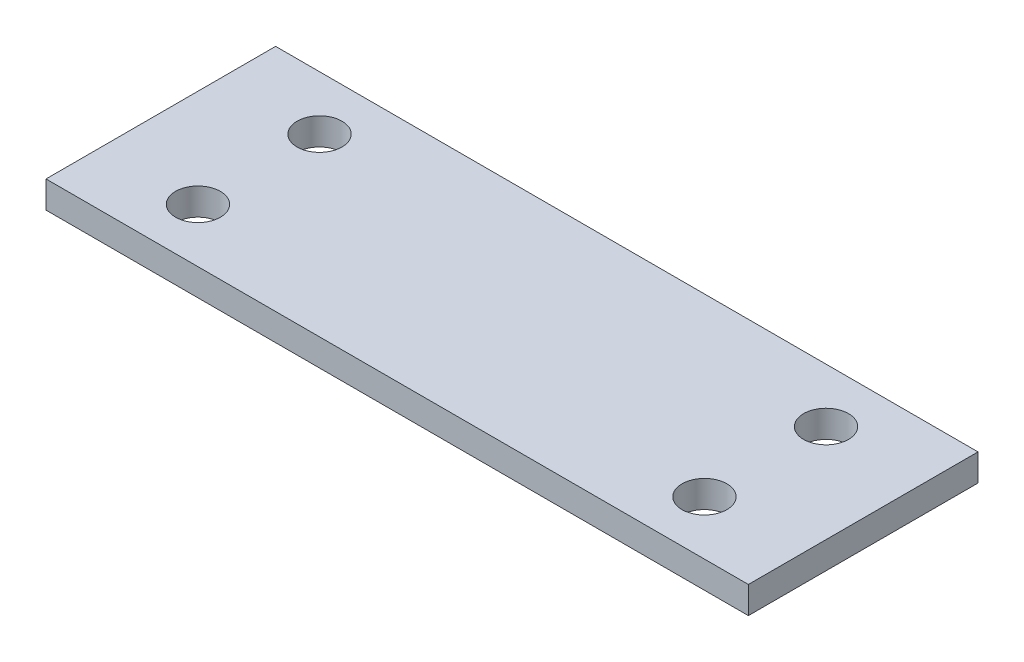
ISO-10303-21;
HEADER;
FILE_DESCRIPTION(('STEP AP214'),'2;1');
FILE_NAME('part.step','',(''),(''),'','','');
FILE_SCHEMA(('AUTOMOTIVE_DESIGN { 1 0 10303 214 1 1 1 1 }'));
ENDSEC;
DATA;
#1=APPLICATION_CONTEXT('core data for automotive mechanical design processes');
#2=APPLICATION_PROTOCOL_DEFINITION('international standard','automotive_design',2000,#1);
#3=PRODUCT_CONTEXT('',#1,'mechanical');
#4=PRODUCT('Part','Part','',(#3));
#5=PRODUCT_RELATED_PRODUCT_CATEGORY('part','',(#4));
#6=PRODUCT_DEFINITION_FORMATION('','',#4);
#7=PRODUCT_DEFINITION_CONTEXT('part definition',#1,'design');
#8=PRODUCT_DEFINITION('design','',#6,#7);
#9=PRODUCT_DEFINITION_SHAPE('','',#8);
#10=(LENGTH_UNIT() NAMED_UNIT(*) SI_UNIT(.MILLI.,.METRE.));
#11=(NAMED_UNIT(*) PLANE_ANGLE_UNIT() SI_UNIT($,.RADIAN.));
#12=(NAMED_UNIT(*) SI_UNIT($,.STERADIAN.) SOLID_ANGLE_UNIT());
#13=UNCERTAINTY_MEASURE_WITH_UNIT(LENGTH_MEASURE(1.E-05),#10,'distance_accuracy_value','');
#14=(GEOMETRIC_REPRESENTATION_CONTEXT(3) GLOBAL_UNCERTAINTY_ASSIGNED_CONTEXT((#13)) GLOBAL_UNIT_ASSIGNED_CONTEXT((#10,
#11,#12)) REPRESENTATION_CONTEXT('',''));
#15=CARTESIAN_POINT('',(0.,0.,0.));
#16=DIRECTION('',(0.,0.,1.));
#17=DIRECTION('',(1.,0.,0.));
#18=AXIS2_PLACEMENT_3D('',#15,#16,#17);
#19=CARTESIAN_POINT('',(-61.6640305085016,5.08,-29.8531505250875));
#20=DIRECTION('',(1.,0.,0.));
#21=DIRECTION('',(0.,0.,-1.));
#22=AXIS2_PLACEMENT_3D('',#19,#20,#21);
#23=PLANE('',#22);
#24=DIRECTION('',(0.,0.,1.));
#25=VECTOR('',#24,1.);
#26=CARTESIAN_POINT('',(-61.6640305085016,0.,-29.8531505250875));
#27=LINE('',#26,#25);
#28=CARTESIAN_POINT('',(-61.6640305085016,0.,-29.8531505250875));
#29=VERTEX_POINT('',#28);
#30=CARTESIAN_POINT('',(-61.6640305085016,0.,13.3268494749125));
#31=VERTEX_POINT('',#30);
#32=EDGE_CURVE('E110',#29,#31,#27,.T.);
#33=ORIENTED_EDGE('',*,*,#32,.T.);
#34=DIRECTION('',(0.,-1.,0.));
#35=VECTOR('',#34,1.);
#36=CARTESIAN_POINT('',(-61.6640305085016,5.08,13.3268494749125));
#37=LINE('',#36,#35);
#38=CARTESIAN_POINT('',(-61.6640305085016,5.08,13.3268494749125));
#39=VERTEX_POINT('',#38);
#40=EDGE_CURVE('E11',#39,#31,#37,.T.);
#41=ORIENTED_EDGE('',*,*,#40,.F.);
#42=DIRECTION('',(0.,0.,1.));
#43=VECTOR('',#42,1.);
#44=CARTESIAN_POINT('',(-61.6640305085016,5.08,-29.8531505250875));
#45=LINE('',#44,#43);
#46=CARTESIAN_POINT('',(-61.6640305085016,5.08,-29.8531505250875));
#47=VERTEX_POINT('',#46);
#48=EDGE_CURVE('E94',#47,#39,#45,.T.);
#49=ORIENTED_EDGE('',*,*,#48,.F.);
#50=DIRECTION('',(0.,-1.,0.));
#51=VECTOR('',#50,1.);
#52=CARTESIAN_POINT('',(-61.6640305085016,5.08,-29.8531505250875));
#53=LINE('',#52,#51);
#54=EDGE_CURVE('E106',#47,#29,#53,.T.);
#55=ORIENTED_EDGE('',*,*,#54,.T.);
#56=EDGE_LOOP('',(#33,#41,#49,#55));
#57=FACE_BOUND('',#56,.T.);
#58=ADVANCED_FACE('F42',(#57),#23,.F.);
#59=CARTESIAN_POINT('',(-61.6640305085016,5.08,13.3268494749125));
#60=DIRECTION('',(0.,0.,-1.));
#61=DIRECTION('',(-1.,0.,0.));
#62=AXIS2_PLACEMENT_3D('',#59,#60,#61);
#63=PLANE('',#62);
#64=DIRECTION('',(1.,0.,0.));
#65=VECTOR('',#64,1.);
#66=CARTESIAN_POINT('',(-61.6640305085016,0.,13.3268494749125));
#67=LINE('',#66,#65);
#68=CARTESIAN_POINT('',(70.4159694914983,0.,13.3268494749125));
#69=VERTEX_POINT('',#68);
#70=EDGE_CURVE('E99',#31,#69,#67,.T.);
#71=ORIENTED_EDGE('',*,*,#70,.T.);
#72=DIRECTION('',(0.,-1.,0.));
#73=VECTOR('',#72,1.);
#74=CARTESIAN_POINT('',(70.4159694914983,5.08,13.3268494749125));
#75=LINE('',#74,#73);
#76=CARTESIAN_POINT('',(70.4159694914983,5.08,13.3268494749125));
#77=VERTEX_POINT('',#76);
#78=EDGE_CURVE('E51',#77,#69,#75,.T.);
#79=ORIENTED_EDGE('',*,*,#78,.F.);
#80=DIRECTION('',(1.,0.,0.));
#81=VECTOR('',#80,1.);
#82=CARTESIAN_POINT('',(-61.6640305085016,5.08,13.3268494749125));
#83=LINE('',#82,#81);
#84=EDGE_CURVE('E89',#39,#77,#83,.T.);
#85=ORIENTED_EDGE('',*,*,#84,.F.);
#86=ORIENTED_EDGE('',*,*,#40,.T.);
#87=EDGE_LOOP('',(#71,#79,#85,#86));
#88=FACE_BOUND('',#87,.T.);
#89=ADVANCED_FACE('F98',(#88),#63,.F.);
#90=CARTESIAN_POINT('',(70.4159694914984,5.08,-29.8531505250875));
#91=DIRECTION('',(-1.,0.,0.));
#92=DIRECTION('',(0.,0.,1.));
#93=AXIS2_PLACEMENT_3D('',#90,#91,#92);
#94=PLANE('',#93);
#95=DIRECTION('',(0.,0.,-1.));
#96=VECTOR('',#95,1.);
#97=CARTESIAN_POINT('',(70.4159694914984,0.,-29.8531505250875));
#98=LINE('',#97,#96);
#99=CARTESIAN_POINT('',(70.4159694914984,0.,-29.8531505250875));
#100=VERTEX_POINT('',#99);
#101=EDGE_CURVE('E76',#69,#100,#98,.T.);
#102=ORIENTED_EDGE('',*,*,#101,.T.);
#103=DIRECTION('',(0.,-1.,0.));
#104=VECTOR('',#103,1.);
#105=CARTESIAN_POINT('',(70.4159694914984,5.08,-29.8531505250875));
#106=LINE('',#105,#104);
#107=CARTESIAN_POINT('',(70.4159694914984,5.08,-29.8531505250875));
#108=VERTEX_POINT('',#107);
#109=EDGE_CURVE('E101',#108,#100,#106,.T.);
#110=ORIENTED_EDGE('',*,*,#109,.F.);
#111=DIRECTION('',(0.,0.,-1.));
#112=VECTOR('',#111,1.);
#113=CARTESIAN_POINT('',(70.4159694914984,5.08,-29.8531505250875));
#114=LINE('',#113,#112);
#115=EDGE_CURVE('E92',#77,#108,#114,.T.);
#116=ORIENTED_EDGE('',*,*,#115,.F.);
#117=ORIENTED_EDGE('',*,*,#78,.T.);
#118=EDGE_LOOP('',(#102,#110,#116,#117));
#119=FACE_BOUND('',#118,.T.);
#120=ADVANCED_FACE('F102',(#119),#94,.F.);
#121=CARTESIAN_POINT('',(-61.6640305085016,5.08,-29.8531505250875));
#122=DIRECTION('',(0.,0.,1.));
#123=DIRECTION('',(1.,0.,0.));
#124=AXIS2_PLACEMENT_3D('',#121,#122,#123);
#125=PLANE('',#124);
#126=DIRECTION('',(-1.,0.,0.));
#127=VECTOR('',#126,1.);
#128=CARTESIAN_POINT('',(-61.6640305085016,0.,-29.8531505250875));
#129=LINE('',#128,#127);
#130=EDGE_CURVE('E82',#100,#29,#129,.T.);
#131=ORIENTED_EDGE('',*,*,#130,.T.);
#132=ORIENTED_EDGE('',*,*,#54,.F.);
#133=DIRECTION('',(-1.,0.,0.));
#134=VECTOR('',#133,1.);
#135=CARTESIAN_POINT('',(-61.6640305085016,5.08,-29.8531505250875));
#136=LINE('',#135,#134);
#137=EDGE_CURVE('E59',#108,#47,#136,.T.);
#138=ORIENTED_EDGE('',*,*,#137,.F.);
#139=ORIENTED_EDGE('',*,*,#109,.T.);
#140=EDGE_LOOP('',(#131,#132,#138,#139));
#141=FACE_BOUND('',#140,.T.);
#142=ADVANCED_FACE('F124',(#141),#125,.F.);
#143=CARTESIAN_POINT('',(0.,5.08,0.));
#144=DIRECTION('',(0.,1.,0.));
#145=DIRECTION('',(0.,0.,1.));
#146=AXIS2_PLACEMENT_3D('',#143,#144,#145);
#147=PLANE('',#146);
#148=CARTESIAN_POINT('',(-43.2490305085016,5.08,-19.6931505250875));
#149=DIRECTION('',(0.,1.,0.));
#150=DIRECTION('',(0.,0.,1.));
#151=AXIS2_PLACEMENT_3D('',#148,#149,#150);
#152=CIRCLE('',#151,4.2164);
#153=CARTESIAN_POINT('',(-43.2490305085016,5.08,-15.4767505250875));
#154=VERTEX_POINT('',#153);
#155=EDGE_CURVE('E158',#154,#154,#152,.T.);
#156=ORIENTED_EDGE('',*,*,#155,.F.);
#157=EDGE_LOOP('',(#156));
#158=FACE_BOUND('',#157,.T.);
#159=CARTESIAN_POINT('',(-43.2490305085016,5.08,3.16684947491247));
#160=DIRECTION('',(0.,1.,0.));
#161=DIRECTION('',(0.,0.,1.));
#162=AXIS2_PLACEMENT_3D('',#159,#160,#161);
#163=CIRCLE('',#162,4.2164);
#164=CARTESIAN_POINT('',(-43.2490305085016,5.08,7.38324947491247));
#165=VERTEX_POINT('',#164);
#166=EDGE_CURVE('E150',#165,#165,#163,.T.);
#167=ORIENTED_EDGE('',*,*,#166,.F.);
#168=EDGE_LOOP('',(#167));
#169=FACE_BOUND('',#168,.T.);
#170=CARTESIAN_POINT('',(52.0009694914984,5.08,-19.6931505250875));
#171=DIRECTION('',(0.,1.,0.));
#172=DIRECTION('',(0.,0.,1.));
#173=AXIS2_PLACEMENT_3D('',#170,#171,#172);
#174=CIRCLE('',#173,4.2164);
#175=CARTESIAN_POINT('',(52.0009694914984,5.08,-15.4767505250875));
#176=VERTEX_POINT('',#175);
#177=EDGE_CURVE('E142',#176,#176,#174,.T.);
#178=ORIENTED_EDGE('',*,*,#177,.F.);
#179=EDGE_LOOP('',(#178));
#180=FACE_BOUND('',#179,.T.);
#181=CARTESIAN_POINT('',(52.0009694914984,5.08,3.16684947491247));
#182=DIRECTION('',(0.,1.,0.));
#183=DIRECTION('',(0.,0.,1.));
#184=AXIS2_PLACEMENT_3D('',#181,#182,#183);
#185=CIRCLE('',#184,4.2164);
#186=CARTESIAN_POINT('',(52.0009694914984,5.08,7.38324947491247));
#187=VERTEX_POINT('',#186);
#188=EDGE_CURVE('E134',#187,#187,#185,.T.);
#189=ORIENTED_EDGE('',*,*,#188,.F.);
#190=EDGE_LOOP('',(#189));
#191=FACE_BOUND('',#190,.T.);
#192=ORIENTED_EDGE('',*,*,#48,.T.);
#193=ORIENTED_EDGE('',*,*,#84,.T.);
#194=ORIENTED_EDGE('',*,*,#115,.T.);
#195=ORIENTED_EDGE('',*,*,#137,.T.);
#196=EDGE_LOOP('',(#192,#193,#194,#195));
#197=FACE_BOUND('',#196,.T.);
#198=ADVANCED_FACE('F90',(#158,#169,#180,#191,#197),#147,.T.);
#199=CARTESIAN_POINT('',(0.,0.,0.));
#200=DIRECTION('',(0.,1.,0.));
#201=DIRECTION('',(0.,0.,1.));
#202=AXIS2_PLACEMENT_3D('',#199,#200,#201);
#203=PLANE('',#202);
#204=CARTESIAN_POINT('',(-43.2490305085016,0.,-19.6931505250875));
#205=DIRECTION('',(0.,1.,0.));
#206=DIRECTION('',(0.,0.,1.));
#207=AXIS2_PLACEMENT_3D('',#204,#205,#206);
#208=CIRCLE('',#207,4.2164);
#209=CARTESIAN_POINT('',(-43.2490305085016,0.,-15.4767505250875));
#210=VERTEX_POINT('',#209);
#211=EDGE_CURVE('E154',#210,#210,#208,.T.);
#212=ORIENTED_EDGE('',*,*,#211,.T.);
#213=EDGE_LOOP('',(#212));
#214=FACE_BOUND('',#213,.T.);
#215=CARTESIAN_POINT('',(-43.2490305085016,0.,3.16684947491247));
#216=DIRECTION('',(0.,1.,0.));
#217=DIRECTION('',(0.,0.,1.));
#218=AXIS2_PLACEMENT_3D('',#215,#216,#217);
#219=CIRCLE('',#218,4.2164);
#220=CARTESIAN_POINT('',(-43.2490305085016,0.,7.38324947491247));
#221=VERTEX_POINT('',#220);
#222=EDGE_CURVE('E146',#221,#221,#219,.T.);
#223=ORIENTED_EDGE('',*,*,#222,.T.);
#224=EDGE_LOOP('',(#223));
#225=FACE_BOUND('',#224,.T.);
#226=CARTESIAN_POINT('',(52.0009694914984,0.,-19.6931505250875));
#227=DIRECTION('',(0.,1.,0.));
#228=DIRECTION('',(0.,0.,1.));
#229=AXIS2_PLACEMENT_3D('',#226,#227,#228);
#230=CIRCLE('',#229,4.2164);
#231=CARTESIAN_POINT('',(52.0009694914984,0.,-15.4767505250875));
#232=VERTEX_POINT('',#231);
#233=EDGE_CURVE('E138',#232,#232,#230,.T.);
#234=ORIENTED_EDGE('',*,*,#233,.T.);
#235=EDGE_LOOP('',(#234));
#236=FACE_BOUND('',#235,.T.);
#237=CARTESIAN_POINT('',(52.0009694914984,0.,3.16684947491247));
#238=DIRECTION('',(0.,1.,0.));
#239=DIRECTION('',(0.,0.,1.));
#240=AXIS2_PLACEMENT_3D('',#237,#238,#239);
#241=CIRCLE('',#240,4.2164);
#242=CARTESIAN_POINT('',(52.0009694914984,0.,7.38324947491247));
#243=VERTEX_POINT('',#242);
#244=EDGE_CURVE('E114',#243,#243,#241,.T.);
#245=ORIENTED_EDGE('',*,*,#244,.T.);
#246=EDGE_LOOP('',(#245));
#247=FACE_BOUND('',#246,.T.);
#248=ORIENTED_EDGE('',*,*,#32,.F.);
#249=ORIENTED_EDGE('',*,*,#130,.F.);
#250=ORIENTED_EDGE('',*,*,#101,.F.);
#251=ORIENTED_EDGE('',*,*,#70,.F.);
#252=EDGE_LOOP('',(#248,#249,#250,#251));
#253=FACE_BOUND('',#252,.T.);
#254=ADVANCED_FACE('F127',(#214,#225,#236,#247,#253),#203,.F.);
#255=CARTESIAN_POINT('',(52.0009694914984,5.08,3.16684947491247));
#256=DIRECTION('',(0.,1.,0.));
#257=DIRECTION('',(0.,0.,1.));
#258=AXIS2_PLACEMENT_3D('',#255,#256,#257);
#259=CYLINDRICAL_SURFACE('',#258,4.2164);
#260=ORIENTED_EDGE('',*,*,#244,.F.);
#261=EDGE_LOOP('',(#260));
#262=FACE_BOUND('',#261,.T.);
#263=ORIENTED_EDGE('',*,*,#188,.T.);
#264=EDGE_LOOP('',(#263));
#265=FACE_BOUND('',#264,.T.);
#266=ADVANCED_FACE('F174',(#262,#265),#259,.F.);
#267=CARTESIAN_POINT('',(52.0009694914984,5.08,-19.6931505250875));
#268=DIRECTION('',(0.,1.,0.));
#269=DIRECTION('',(0.,0.,1.));
#270=AXIS2_PLACEMENT_3D('',#267,#268,#269);
#271=CYLINDRICAL_SURFACE('',#270,4.2164);
#272=ORIENTED_EDGE('',*,*,#233,.F.);
#273=EDGE_LOOP('',(#272));
#274=FACE_BOUND('',#273,.T.);
#275=ORIENTED_EDGE('',*,*,#177,.T.);
#276=EDGE_LOOP('',(#275));
#277=FACE_BOUND('',#276,.T.);
#278=ADVANCED_FACE('F176',(#274,#277),#271,.F.);
#279=CARTESIAN_POINT('',(-43.2490305085016,5.08,3.16684947491247));
#280=DIRECTION('',(0.,1.,0.));
#281=DIRECTION('',(0.,0.,1.));
#282=AXIS2_PLACEMENT_3D('',#279,#280,#281);
#283=CYLINDRICAL_SURFACE('',#282,4.2164);
#284=ORIENTED_EDGE('',*,*,#222,.F.);
#285=EDGE_LOOP('',(#284));
#286=FACE_BOUND('',#285,.T.);
#287=ORIENTED_EDGE('',*,*,#166,.T.);
#288=EDGE_LOOP('',(#287));
#289=FACE_BOUND('',#288,.T.);
#290=ADVANCED_FACE('F183',(#286,#289),#283,.F.);
#291=CARTESIAN_POINT('',(-43.2490305085016,5.08,-19.6931505250875));
#292=DIRECTION('',(0.,1.,0.));
#293=DIRECTION('',(0.,0.,1.));
#294=AXIS2_PLACEMENT_3D('',#291,#292,#293);
#295=CYLINDRICAL_SURFACE('',#294,4.2164);
#296=ORIENTED_EDGE('',*,*,#211,.F.);
#297=EDGE_LOOP('',(#296));
#298=FACE_BOUND('',#297,.T.);
#299=ORIENTED_EDGE('',*,*,#155,.T.);
#300=EDGE_LOOP('',(#299));
#301=FACE_BOUND('',#300,.T.);
#302=ADVANCED_FACE('F163',(#298,#301),#295,.F.);
#303=CLOSED_SHELL('',(#58,#89,#120,#142,#198,#254,#266,#278,#290,#302));
#304=MANIFOLD_SOLID_BREP('B2',#303);
#305=ADVANCED_BREP_SHAPE_REPRESENTATION('',(#18,#304),#14);
#306=SHAPE_DEFINITION_REPRESENTATION(#9,#305);
ENDSEC;
END-ISO-10303-21;
